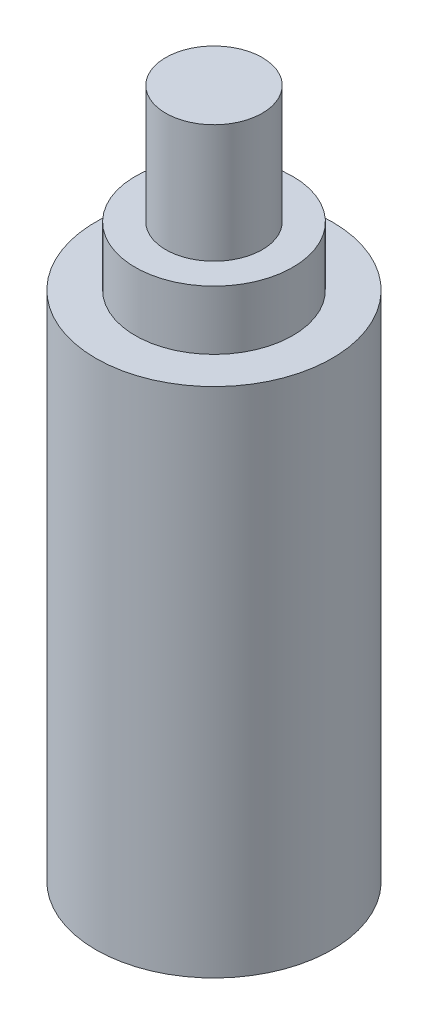
ISO-10303-21;
HEADER;
FILE_DESCRIPTION(('STEP AP214'),'2;1');
FILE_NAME('part.step','',(''),(''),'','','');
FILE_SCHEMA(('AUTOMOTIVE_DESIGN { 1 0 10303 214 1 1 1 1 }'));
ENDSEC;
DATA;
#1=APPLICATION_CONTEXT('core data for automotive mechanical design processes');
#2=APPLICATION_PROTOCOL_DEFINITION('international standard','automotive_design',2000,#1);
#3=PRODUCT_CONTEXT('',#1,'mechanical');
#4=PRODUCT('Part','Part','',(#3));
#5=PRODUCT_RELATED_PRODUCT_CATEGORY('part','',(#4));
#6=PRODUCT_DEFINITION_FORMATION('','',#4);
#7=PRODUCT_DEFINITION_CONTEXT('part definition',#1,'design');
#8=PRODUCT_DEFINITION('design','',#6,#7);
#9=PRODUCT_DEFINITION_SHAPE('','',#8);
#10=(LENGTH_UNIT() NAMED_UNIT(*) SI_UNIT(.MILLI.,.METRE.));
#11=(NAMED_UNIT(*) PLANE_ANGLE_UNIT() SI_UNIT($,.RADIAN.));
#12=(NAMED_UNIT(*) SI_UNIT($,.STERADIAN.) SOLID_ANGLE_UNIT());
#13=UNCERTAINTY_MEASURE_WITH_UNIT(LENGTH_MEASURE(1.E-05),#10,'distance_accuracy_value','');
#14=(GEOMETRIC_REPRESENTATION_CONTEXT(3) GLOBAL_UNCERTAINTY_ASSIGNED_CONTEXT((#13)) GLOBAL_UNIT_ASSIGNED_CONTEXT((#10,
#11,#12)) REPRESENTATION_CONTEXT('',''));
#15=CARTESIAN_POINT('',(0.,0.,0.));
#16=DIRECTION('',(0.,0.,1.));
#17=DIRECTION('',(1.,0.,0.));
#18=AXIS2_PLACEMENT_3D('',#15,#16,#17);
#19=CARTESIAN_POINT('',(-15.24,33.02,-15.24));
#20=DIRECTION('',(0.,-1.,0.));
#21=DIRECTION('',(0.,0.,-1.));
#22=AXIS2_PLACEMENT_3D('',#19,#20,#21);
#23=CYLINDRICAL_SURFACE('',#22,7.62);
#24=CARTESIAN_POINT('',(-15.24,33.02,-15.24));
#25=DIRECTION('',(0.,1.,0.));
#26=DIRECTION('',(0.,0.,1.));
#27=AXIS2_PLACEMENT_3D('',#24,#25,#26);
#28=CIRCLE('',#27,7.62);
#29=CARTESIAN_POINT('',(-15.24,33.02,-7.62));
#30=VERTEX_POINT('',#29);
#31=EDGE_CURVE('E57',#30,#30,#28,.T.);
#32=ORIENTED_EDGE('',*,*,#31,.F.);
#33=EDGE_LOOP('',(#32));
#34=FACE_BOUND('',#33,.T.);
#35=CARTESIAN_POINT('',(-15.24,0.,-15.24));
#36=DIRECTION('',(0.,1.,0.));
#37=DIRECTION('',(0.,0.,1.));
#38=AXIS2_PLACEMENT_3D('',#35,#36,#37);
#39=CIRCLE('',#38,7.62);
#40=CARTESIAN_POINT('',(-15.24,0.,-7.62));
#41=VERTEX_POINT('',#40);
#42=EDGE_CURVE('E46',#41,#41,#39,.T.);
#43=ORIENTED_EDGE('',*,*,#42,.T.);
#44=EDGE_LOOP('',(#43));
#45=FACE_BOUND('',#44,.T.);
#46=ADVANCED_FACE('F43',(#34,#45),#23,.T.);
#47=CARTESIAN_POINT('',(-15.24,33.02,-15.24));
#48=DIRECTION('',(0.,1.,0.));
#49=DIRECTION('',(0.,0.,1.));
#50=AXIS2_PLACEMENT_3D('',#47,#48,#49);
#51=PLANE('',#50);
#52=CARTESIAN_POINT('',(-15.24,33.02,-15.24));
#53=DIRECTION('',(0.,1.,0.));
#54=DIRECTION('',(0.,0.,1.));
#55=AXIS2_PLACEMENT_3D('',#52,#53,#54);
#56=CIRCLE('',#55,5.08);
#57=CARTESIAN_POINT('',(-15.24,33.02,-20.32));
#58=VERTEX_POINT('',#57);
#59=EDGE_CURVE('E51',#58,#58,#56,.T.);
#60=ORIENTED_EDGE('',*,*,#59,.F.);
#61=EDGE_LOOP('',(#60));
#62=FACE_BOUND('',#61,.T.);
#63=ORIENTED_EDGE('',*,*,#31,.T.);
#64=EDGE_LOOP('',(#63));
#65=FACE_BOUND('',#64,.T.);
#66=ADVANCED_FACE('F77',(#62,#65),#51,.T.);
#67=CARTESIAN_POINT('',(-15.24,0.,-15.24));
#68=DIRECTION('',(0.,1.,0.));
#69=DIRECTION('',(0.,0.,1.));
#70=AXIS2_PLACEMENT_3D('',#67,#68,#69);
#71=PLANE('',#70);
#72=ORIENTED_EDGE('',*,*,#42,.F.);
#73=EDGE_LOOP('',(#72));
#74=FACE_BOUND('',#73,.T.);
#75=ADVANCED_FACE('F74',(#74),#71,.F.);
#76=CARTESIAN_POINT('',(-15.24,36.83,-15.24));
#77=DIRECTION('',(0.,-1.,0.));
#78=DIRECTION('',(0.,0.,-1.));
#79=AXIS2_PLACEMENT_3D('',#76,#77,#78);
#80=CYLINDRICAL_SURFACE('',#79,5.08);
#81=CARTESIAN_POINT('',(-15.24,36.83,-15.24));
#82=DIRECTION('',(0.,1.,0.));
#83=DIRECTION('',(0.,0.,1.));
#84=AXIS2_PLACEMENT_3D('',#81,#82,#83);
#85=CIRCLE('',#84,5.08);
#86=CARTESIAN_POINT('',(-15.24,36.83,-20.32));
#87=VERTEX_POINT('',#86);
#88=EDGE_CURVE('E62',#87,#87,#85,.T.);
#89=CARTESIAN_POINT('',(-15.24,36.83,-20.32));
#90=CARTESIAN_POINT('',(-15.24,36.7903125,-20.32));
#91=CARTESIAN_POINT('',(-15.24,36.750625,-20.32));
#92=CARTESIAN_POINT('',(-15.24,36.67125,-20.32));
#93=CARTESIAN_POINT('',(-15.24,36.6315625,-20.32));
#94=CARTESIAN_POINT('',(-15.24,36.5521875,-20.32));
#95=CARTESIAN_POINT('',(-15.24,36.5125,-20.32));
#96=CARTESIAN_POINT('',(-15.24,36.433125,-20.32));
#97=CARTESIAN_POINT('',(-15.24,36.3934375,-20.32));
#98=CARTESIAN_POINT('',(-15.24,36.3140625,-20.32));
#99=CARTESIAN_POINT('',(-15.24,36.274375,-20.32));
#100=CARTESIAN_POINT('',(-15.24,36.195,-20.32));
#101=CARTESIAN_POINT('',(-15.24,36.1553125,-20.32));
#102=CARTESIAN_POINT('',(-15.24,36.0759375,-20.32));
#103=CARTESIAN_POINT('',(-15.24,36.03625,-20.32));
#104=CARTESIAN_POINT('',(-15.24,35.956875,-20.32));
#105=CARTESIAN_POINT('',(-15.24,35.9171875,-20.32));
#106=CARTESIAN_POINT('',(-15.24,35.8378125,-20.32));
#107=CARTESIAN_POINT('',(-15.24,35.798125,-20.32));
#108=CARTESIAN_POINT('',(-15.24,35.71875,-20.32));
#109=CARTESIAN_POINT('',(-15.24,35.6790625,-20.32));
#110=CARTESIAN_POINT('',(-15.24,35.5996875,-20.32));
#111=CARTESIAN_POINT('',(-15.24,35.56,-20.32));
#112=CARTESIAN_POINT('',(-15.24,35.480625,-20.32));
#113=CARTESIAN_POINT('',(-15.24,35.4409375,-20.32));
#114=CARTESIAN_POINT('',(-15.24,35.3615625,-20.32));
#115=CARTESIAN_POINT('',(-15.24,35.321875,-20.32));
#116=CARTESIAN_POINT('',(-15.24,35.2425,-20.32));
#117=CARTESIAN_POINT('',(-15.24,35.2028125,-20.32));
#118=CARTESIAN_POINT('',(-15.24,35.1234375,-20.32));
#119=CARTESIAN_POINT('',(-15.24,35.08375,-20.32));
#120=CARTESIAN_POINT('',(-15.24,35.004375,-20.32));
#121=CARTESIAN_POINT('',(-15.24,34.9646875,-20.32));
#122=CARTESIAN_POINT('',(-15.24,34.8853125,-20.32));
#123=CARTESIAN_POINT('',(-15.24,34.845625,-20.32));
#124=CARTESIAN_POINT('',(-15.24,34.76625,-20.32));
#125=CARTESIAN_POINT('',(-15.24,34.7265625,-20.32));
#126=CARTESIAN_POINT('',(-15.24,34.6471875,-20.32));
#127=CARTESIAN_POINT('',(-15.24,34.6075,-20.32));
#128=CARTESIAN_POINT('',(-15.24,34.528125,-20.32));
#129=CARTESIAN_POINT('',(-15.24,34.4884375,-20.32));
#130=CARTESIAN_POINT('',(-15.24,34.4090625,-20.32));
#131=CARTESIAN_POINT('',(-15.24,34.369375,-20.32));
#132=CARTESIAN_POINT('',(-15.24,34.29,-20.32));
#133=CARTESIAN_POINT('',(-15.24,34.2503125,-20.32));
#134=CARTESIAN_POINT('',(-15.24,34.1709375,-20.32));
#135=CARTESIAN_POINT('',(-15.24,34.13125,-20.32));
#136=CARTESIAN_POINT('',(-15.24,34.051875,-20.32));
#137=CARTESIAN_POINT('',(-15.24,34.0121875,-20.32));
#138=CARTESIAN_POINT('',(-15.24,33.9328125,-20.32));
#139=CARTESIAN_POINT('',(-15.24,33.893125,-20.32));
#140=CARTESIAN_POINT('',(-15.24,33.81375,-20.32));
#141=CARTESIAN_POINT('',(-15.24,33.7740625,-20.32));
#142=CARTESIAN_POINT('',(-15.24,33.6946875,-20.32));
#143=CARTESIAN_POINT('',(-15.24,33.655,-20.32));
#144=CARTESIAN_POINT('',(-15.24,33.575625,-20.32));
#145=CARTESIAN_POINT('',(-15.24,33.5359375,-20.32));
#146=CARTESIAN_POINT('',(-15.24,33.4565625,-20.32));
#147=CARTESIAN_POINT('',(-15.24,33.416875,-20.32));
#148=CARTESIAN_POINT('',(-15.24,33.3375,-20.32));
#149=CARTESIAN_POINT('',(-15.24,33.2978125,-20.32));
#150=CARTESIAN_POINT('',(-15.24,33.2184375,-20.32));
#151=CARTESIAN_POINT('',(-15.24,33.17875,-20.32));
#152=CARTESIAN_POINT('',(-15.24,33.099375,-20.32));
#153=CARTESIAN_POINT('',(-15.24,33.0596875,-20.32));
#154=CARTESIAN_POINT('',(-15.24,33.02,-20.32));
#155=B_SPLINE_CURVE_WITH_KNOTS('',3,(#89,#90,#91,#92,#93,#94,#95,#96,#97,#98,#99,#100,#101,#102,
#103,#104,#105,#106,#107,#108,#109,#110,#111,#112,#113,#114,#115,#116,#117,#118,#119,#120,#121,
#122,#123,#124,#125,#126,#127,#128,#129,#130,#131,#132,#133,#134,#135,#136,#137,#138,#139,#140,
#141,#142,#143,#144,#145,#146,#147,#148,#149,#150,#151,#152,#153,#154),.UNSPECIFIED.,.F.,.F.,(4,
2,2,2,2,2,2,2,2,2,2,2,2,2,2,2,2,2,2,2,2,2,2,2,2,2,2,2,2,2,2,2,4),(0.,0.119062500000003,
0.238125000000006,0.357187500000002,0.476250000000004,0.5953125,0.714375000000003,
0.833437500000006,0.952500000000002,1.0715625,1.190625,1.3096875,1.42875000000001,1.5478125,
1.66687500000001,1.7859375,1.905,2.02406250000001,2.143125,2.26218750000001,2.38125,2.5003125,
2.61937500000001,2.7384375,2.85750000000001,2.9765625,3.095625,3.2146875,3.33375,
3.45281250000001,3.571875,3.6909375,3.81),.UNSPECIFIED.);
#156=EDGE_CURVE('BSEAM76',#87,#58,#155,.T.);
#157=ORIENTED_EDGE('',*,*,#88,.F.);
#158=ORIENTED_EDGE('',*,*,#59,.T.);
#159=ORIENTED_EDGE('',*,*,#156,.T.);
#160=ORIENTED_EDGE('',*,*,#156,.F.);
#161=EDGE_LOOP('',(#157,#159,#158,#160));
#162=FACE_BOUND('',#161,.T.);
#163=ADVANCED_FACE('F76',(#162),#80,.T.);
#164=CARTESIAN_POINT('',(-15.24,36.83,-15.24));
#165=DIRECTION('',(0.,1.,0.));
#166=DIRECTION('',(0.,0.,1.));
#167=AXIS2_PLACEMENT_3D('',#164,#165,#166);
#168=PLANE('',#167);
#169=CARTESIAN_POINT('',(-15.24,36.83,-15.24));
#170=DIRECTION('',(0.,1.,0.));
#171=DIRECTION('',(0.,0.,1.));
#172=AXIS2_PLACEMENT_3D('',#169,#170,#171);
#173=CIRCLE('',#172,3.1115);
#174=CARTESIAN_POINT('',(-15.24,36.83,-18.3515));
#175=VERTEX_POINT('',#174);
#176=EDGE_CURVE('E10',#175,#175,#173,.T.);
#177=ORIENTED_EDGE('',*,*,#176,.F.);
#178=EDGE_LOOP('',(#177));
#179=FACE_BOUND('',#178,.T.);
#180=ORIENTED_EDGE('',*,*,#88,.T.);
#181=EDGE_LOOP('',(#180));
#182=FACE_BOUND('',#181,.T.);
#183=ADVANCED_FACE('F83',(#179,#182),#168,.T.);
#184=CARTESIAN_POINT('',(-15.24,44.45,-15.24));
#185=DIRECTION('',(0.,-1.,0.));
#186=DIRECTION('',(0.,0.,-1.));
#187=AXIS2_PLACEMENT_3D('',#184,#185,#186);
#188=CYLINDRICAL_SURFACE('',#187,3.1115);
#189=CARTESIAN_POINT('',(-15.24,44.45,-15.24));
#190=DIRECTION('',(0.,1.,0.));
#191=DIRECTION('',(0.,0.,1.));
#192=AXIS2_PLACEMENT_3D('',#189,#190,#191);
#193=CIRCLE('',#192,3.1115);
#194=CARTESIAN_POINT('',(-15.24,44.45,-18.3515));
#195=VERTEX_POINT('',#194);
#196=EDGE_CURVE('E61',#195,#195,#193,.T.);
#197=CARTESIAN_POINT('',(-15.24,44.45,-18.3515));
#198=CARTESIAN_POINT('',(-15.24,44.370625,-18.3515));
#199=CARTESIAN_POINT('',(-15.24,44.29125,-18.3515));
#200=CARTESIAN_POINT('',(-15.24,44.1325,-18.3515));
#201=CARTESIAN_POINT('',(-15.24,44.053125,-18.3515));
#202=CARTESIAN_POINT('',(-15.24,43.894375,-18.3515));
#203=CARTESIAN_POINT('',(-15.24,43.815,-18.3515));
#204=CARTESIAN_POINT('',(-15.24,43.65625,-18.3515));
#205=CARTESIAN_POINT('',(-15.24,43.576875,-18.3515));
#206=CARTESIAN_POINT('',(-15.24,43.418125,-18.3515));
#207=CARTESIAN_POINT('',(-15.24,43.33875,-18.3515));
#208=CARTESIAN_POINT('',(-15.24,43.18,-18.3515));
#209=CARTESIAN_POINT('',(-15.24,43.100625,-18.3515));
#210=CARTESIAN_POINT('',(-15.24,42.941875,-18.3515));
#211=CARTESIAN_POINT('',(-15.24,42.8625,-18.3515));
#212=CARTESIAN_POINT('',(-15.24,42.70375,-18.3515));
#213=CARTESIAN_POINT('',(-15.24,42.624375,-18.3515));
#214=CARTESIAN_POINT('',(-15.24,42.465625,-18.3515));
#215=CARTESIAN_POINT('',(-15.24,42.38625,-18.3515));
#216=CARTESIAN_POINT('',(-15.24,42.2275,-18.3515));
#217=CARTESIAN_POINT('',(-15.24,42.148125,-18.3515));
#218=CARTESIAN_POINT('',(-15.24,41.989375,-18.3515));
#219=CARTESIAN_POINT('',(-15.24,41.91,-18.3515));
#220=CARTESIAN_POINT('',(-15.24,41.75125,-18.3515));
#221=CARTESIAN_POINT('',(-15.24,41.671875,-18.3515));
#222=CARTESIAN_POINT('',(-15.24,41.513125,-18.3515));
#223=CARTESIAN_POINT('',(-15.24,41.43375,-18.3515));
#224=CARTESIAN_POINT('',(-15.24,41.275,-18.3515));
#225=CARTESIAN_POINT('',(-15.24,41.195625,-18.3515));
#226=CARTESIAN_POINT('',(-15.24,41.036875,-18.3515));
#227=CARTESIAN_POINT('',(-15.24,40.9575,-18.3515));
#228=CARTESIAN_POINT('',(-15.24,40.79875,-18.3515));
#229=CARTESIAN_POINT('',(-15.24,40.719375,-18.3515));
#230=CARTESIAN_POINT('',(-15.24,40.560625,-18.3515));
#231=CARTESIAN_POINT('',(-15.24,40.48125,-18.3515));
#232=CARTESIAN_POINT('',(-15.24,40.3225,-18.3515));
#233=CARTESIAN_POINT('',(-15.24,40.243125,-18.3515));
#234=CARTESIAN_POINT('',(-15.24,40.084375,-18.3515));
#235=CARTESIAN_POINT('',(-15.24,40.005,-18.3515));
#236=CARTESIAN_POINT('',(-15.24,39.84625,-18.3515));
#237=CARTESIAN_POINT('',(-15.24,39.766875,-18.3515));
#238=CARTESIAN_POINT('',(-15.24,39.608125,-18.3515));
#239=CARTESIAN_POINT('',(-15.24,39.52875,-18.3515));
#240=CARTESIAN_POINT('',(-15.24,39.37,-18.3515));
#241=CARTESIAN_POINT('',(-15.24,39.290625,-18.3515));
#242=CARTESIAN_POINT('',(-15.24,39.131875,-18.3515));
#243=CARTESIAN_POINT('',(-15.24,39.0525,-18.3515));
#244=CARTESIAN_POINT('',(-15.24,38.89375,-18.3515));
#245=CARTESIAN_POINT('',(-15.24,38.814375,-18.3515));
#246=CARTESIAN_POINT('',(-15.24,38.655625,-18.3515));
#247=CARTESIAN_POINT('',(-15.24,38.57625,-18.3515));
#248=CARTESIAN_POINT('',(-15.24,38.4175,-18.3515));
#249=CARTESIAN_POINT('',(-15.24,38.338125,-18.3515));
#250=CARTESIAN_POINT('',(-15.24,38.179375,-18.3515));
#251=CARTESIAN_POINT('',(-15.24,38.1,-18.3515));
#252=CARTESIAN_POINT('',(-15.24,37.94125,-18.3515));
#253=CARTESIAN_POINT('',(-15.24,37.861875,-18.3515));
#254=CARTESIAN_POINT('',(-15.24,37.703125,-18.3515));
#255=CARTESIAN_POINT('',(-15.24,37.62375,-18.3515));
#256=CARTESIAN_POINT('',(-15.24,37.465,-18.3515));
#257=CARTESIAN_POINT('',(-15.24,37.385625,-18.3515));
#258=CARTESIAN_POINT('',(-15.24,37.226875,-18.3515));
#259=CARTESIAN_POINT('',(-15.24,37.1475,-18.3515));
#260=CARTESIAN_POINT('',(-15.24,36.98875,-18.3515));
#261=CARTESIAN_POINT('',(-15.24,36.909375,-18.3515));
#262=CARTESIAN_POINT('',(-15.24,36.83,-18.3515));
#263=B_SPLINE_CURVE_WITH_KNOTS('',3,(#197,#198,#199,#200,#201,#202,#203,#204,#205,#206,#207,
#208,#209,#210,#211,#212,#213,#214,#215,#216,#217,#218,#219,#220,#221,#222,#223,#224,#225,#226,
#227,#228,#229,#230,#231,#232,#233,#234,#235,#236,#237,#238,#239,#240,#241,#242,#243,#244,#245,
#246,#247,#248,#249,#250,#251,#252,#253,#254,#255,#256,#257,#258,#259,#260,#261,#262),
.UNSPECIFIED.,.F.,.F.,(4,2,2,2,2,2,2,2,2,2,2,2,2,2,2,2,2,2,2,2,2,2,2,2,2,2,2,2,2,2,2,2,4),(0.,
0.238125000000006,0.476250000000004,0.714375000000003,0.952500000000002,1.190625,
1.42875000000001,1.66687500000001,1.905,2.143125,2.38125,2.61937500000001,2.85750000000001,
3.095625,3.33375,3.571875,3.81000000000001,4.04812500000001,4.28625000000001,4.524375,4.7625,
5.00062500000001,5.23875000000001,5.47687500000001,5.71500000000001,5.953125,6.19125000000001,
6.42937500000001,6.66750000000001,6.90562500000001,7.14375,7.381875,7.62000000000001),.UNSPECIFIED.);
#264=EDGE_CURVE('BSEAM117',#195,#175,#263,.T.);
#265=ORIENTED_EDGE('',*,*,#196,.F.);
#266=ORIENTED_EDGE('',*,*,#176,.T.);
#267=ORIENTED_EDGE('',*,*,#264,.T.);
#268=ORIENTED_EDGE('',*,*,#264,.F.);
#269=EDGE_LOOP('',(#265,#267,#266,#268));
#270=FACE_BOUND('',#269,.T.);
#271=ADVANCED_FACE('F117',(#270),#188,.T.);
#272=CARTESIAN_POINT('',(-15.24,44.45,-15.24));
#273=DIRECTION('',(0.,1.,0.));
#274=DIRECTION('',(0.,0.,1.));
#275=AXIS2_PLACEMENT_3D('',#272,#273,#274);
#276=PLANE('',#275);
#277=ORIENTED_EDGE('',*,*,#196,.T.);
#278=EDGE_LOOP('',(#277));
#279=FACE_BOUND('',#278,.T.);
#280=ADVANCED_FACE('F127',(#279),#276,.T.);
#281=CLOSED_SHELL('',(#46,#66,#75,#163,#183,#271,#280));
#282=MANIFOLD_SOLID_BREP('B2',#281);
#283=ADVANCED_BREP_SHAPE_REPRESENTATION('',(#18,#282),#14);
#284=SHAPE_DEFINITION_REPRESENTATION(#9,#283);
ENDSEC;
END-ISO-10303-21;
